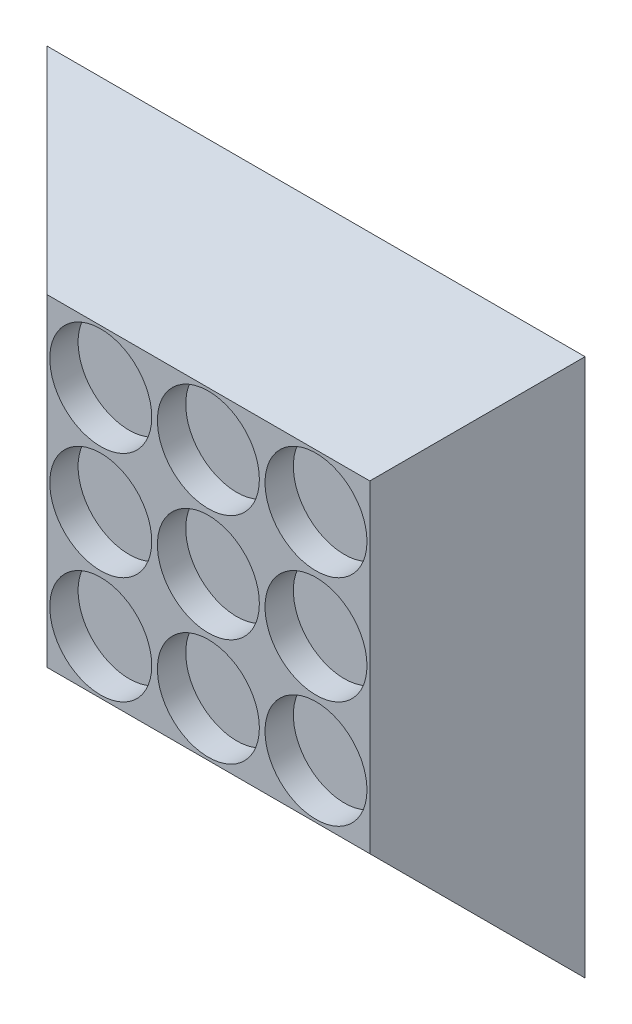
ISO-10303-21;
HEADER;
FILE_DESCRIPTION(('STEP AP214'),'2;1');
FILE_NAME('part.step','',(''),(''),'','','');
FILE_SCHEMA(('AUTOMOTIVE_DESIGN { 1 0 10303 214 1 1 1 1 }'));
ENDSEC;
DATA;
#1=APPLICATION_CONTEXT('core data for automotive mechanical design processes');
#2=APPLICATION_PROTOCOL_DEFINITION('international standard','automotive_design',2000,#1);
#3=PRODUCT_CONTEXT('',#1,'mechanical');
#4=PRODUCT('Part','Part','',(#3));
#5=PRODUCT_RELATED_PRODUCT_CATEGORY('part','',(#4));
#6=PRODUCT_DEFINITION_FORMATION('','',#4);
#7=PRODUCT_DEFINITION_CONTEXT('part definition',#1,'design');
#8=PRODUCT_DEFINITION('design','',#6,#7);
#9=PRODUCT_DEFINITION_SHAPE('','',#8);
#10=(LENGTH_UNIT() NAMED_UNIT(*) SI_UNIT(.MILLI.,.METRE.));
#11=(NAMED_UNIT(*) PLANE_ANGLE_UNIT() SI_UNIT($,.RADIAN.));
#12=(NAMED_UNIT(*) SI_UNIT($,.STERADIAN.) SOLID_ANGLE_UNIT());
#13=UNCERTAINTY_MEASURE_WITH_UNIT(LENGTH_MEASURE(1.E-05),#10,'distance_accuracy_value','');
#14=(GEOMETRIC_REPRESENTATION_CONTEXT(3) GLOBAL_UNCERTAINTY_ASSIGNED_CONTEXT((#13)) GLOBAL_UNIT_ASSIGNED_CONTEXT((#10,
#11,#12)) REPRESENTATION_CONTEXT('',''));
#15=CARTESIAN_POINT('',(0.,0.,0.));
#16=DIRECTION('',(0.,0.,1.));
#17=DIRECTION('',(1.,0.,0.));
#18=AXIS2_PLACEMENT_3D('',#15,#16,#17);
#19=CARTESIAN_POINT('',(0.,0.,19.));
#20=DIRECTION('',(0.,0.,1.));
#21=DIRECTION('',(1.,0.,0.));
#22=AXIS2_PLACEMENT_3D('',#19,#20,#21);
#23=PLANE('',#22);
#24=CARTESIAN_POINT('',(19.,0.,19.));
#25=DIRECTION('',(0.,0.,1.));
#26=DIRECTION('',(1.,0.,0.));
#27=AXIS2_PLACEMENT_3D('',#24,#25,#26);
#28=CIRCLE('',#27,9.);
#29=CARTESIAN_POINT('',(28.,0.,19.));
#30=VERTEX_POINT('',#29);
#31=EDGE_CURVE('E164',#30,#30,#28,.T.);
#32=ORIENTED_EDGE('',*,*,#31,.F.);
#33=EDGE_LOOP('',(#32));
#34=FACE_BOUND('',#33,.T.);
#35=CARTESIAN_POINT('',(18.9999999999999,19.,19.));
#36=DIRECTION('',(0.,0.,1.));
#37=DIRECTION('',(1.,0.,0.));
#38=AXIS2_PLACEMENT_3D('',#35,#36,#37);
#39=CIRCLE('',#38,9.);
#40=CARTESIAN_POINT('',(27.9999999999999,19.,19.));
#41=VERTEX_POINT('',#40);
#42=EDGE_CURVE('E177',#41,#41,#39,.T.);
#43=ORIENTED_EDGE('',*,*,#42,.F.);
#44=EDGE_LOOP('',(#43));
#45=FACE_BOUND('',#44,.T.);
#46=CARTESIAN_POINT('',(0.,19.,19.));
#47=DIRECTION('',(0.,0.,1.));
#48=DIRECTION('',(1.,0.,0.));
#49=AXIS2_PLACEMENT_3D('',#46,#47,#48);
#50=CIRCLE('',#49,9.);
#51=CARTESIAN_POINT('',(8.99999999999993,19.,19.));
#52=VERTEX_POINT('',#51);
#53=EDGE_CURVE('E183',#52,#52,#50,.T.);
#54=ORIENTED_EDGE('',*,*,#53,.F.);
#55=EDGE_LOOP('',(#54));
#56=FACE_BOUND('',#55,.T.);
#57=CARTESIAN_POINT('',(-19.,-1.32676290876039E-13,19.));
#58=DIRECTION('',(0.,0.,1.));
#59=DIRECTION('',(1.,0.,0.));
#60=AXIS2_PLACEMENT_3D('',#57,#58,#59);
#61=CIRCLE('',#60,9.);
#62=CARTESIAN_POINT('',(-10.,-1.32676290876039E-13,19.));
#63=VERTEX_POINT('',#62);
#64=EDGE_CURVE('E189',#63,#63,#61,.T.);
#65=ORIENTED_EDGE('',*,*,#64,.F.);
#66=EDGE_LOOP('',(#65));
#67=FACE_BOUND('',#66,.T.);
#68=CARTESIAN_POINT('',(-18.9999999999998,-19.0000000000001,19.));
#69=DIRECTION('',(0.,0.,1.));
#70=DIRECTION('',(1.,0.,0.));
#71=AXIS2_PLACEMENT_3D('',#68,#69,#70);
#72=CIRCLE('',#71,9.);
#73=CARTESIAN_POINT('',(-9.9999999999998,-19.0000000000001,19.));
#74=VERTEX_POINT('',#73);
#75=EDGE_CURVE('E203',#74,#74,#72,.T.);
#76=ORIENTED_EDGE('',*,*,#75,.F.);
#77=EDGE_LOOP('',(#76));
#78=FACE_BOUND('',#77,.T.);
#79=CARTESIAN_POINT('',(19.0000000000002,-19.,19.));
#80=DIRECTION('',(0.,0.,1.));
#81=DIRECTION('',(1.,0.,0.));
#82=AXIS2_PLACEMENT_3D('',#79,#80,#81);
#83=CIRCLE('',#82,9.);
#84=CARTESIAN_POINT('',(28.0000000000002,-19.,19.));
#85=VERTEX_POINT('',#84);
#86=EDGE_CURVE('E213',#85,#85,#83,.T.);
#87=ORIENTED_EDGE('',*,*,#86,.F.);
#88=EDGE_LOOP('',(#87));
#89=FACE_BOUND('',#88,.T.);
#90=CARTESIAN_POINT('',(1.97851021854869E-13,-19.,19.));
#91=DIRECTION('',(0.,0.,1.));
#92=DIRECTION('',(1.,0.,0.));
#93=AXIS2_PLACEMENT_3D('',#90,#91,#92);
#94=CIRCLE('',#93,9.);
#95=CARTESIAN_POINT('',(9.0000000000002,-19.,19.));
#96=VERTEX_POINT('',#95);
#97=EDGE_CURVE('E172',#96,#96,#94,.T.);
#98=ORIENTED_EDGE('',*,*,#97,.F.);
#99=EDGE_LOOP('',(#98));
#100=FACE_BOUND('',#99,.T.);
#101=CARTESIAN_POINT('',(-19.0000000000001,18.9999999999999,19.));
#102=DIRECTION('',(0.,0.,1.));
#103=DIRECTION('',(1.,0.,0.));
#104=AXIS2_PLACEMENT_3D('',#101,#102,#103);
#105=CIRCLE('',#104,9.);
#106=CARTESIAN_POINT('',(-10.0000000000001,18.9999999999999,19.));
#107=VERTEX_POINT('',#106);
#108=EDGE_CURVE('E195',#107,#107,#105,.T.);
#109=ORIENTED_EDGE('',*,*,#108,.F.);
#110=EDGE_LOOP('',(#109));
#111=FACE_BOUND('',#110,.T.);
#112=CARTESIAN_POINT('',(0.,0.,19.));
#113=DIRECTION('',(0.,0.,1.));
#114=DIRECTION('',(1.,0.,0.));
#115=AXIS2_PLACEMENT_3D('',#112,#113,#114);
#116=CIRCLE('',#115,9.);
#117=CARTESIAN_POINT('',(9.,0.,19.));
#118=VERTEX_POINT('',#117);
#119=EDGE_CURVE('E98',#118,#118,#116,.T.);
#120=ORIENTED_EDGE('',*,*,#119,.F.);
#121=EDGE_LOOP('',(#120));
#122=FACE_BOUND('',#121,.T.);
#123=DIRECTION('',(0.,1.,0.));
#124=VECTOR('',#123,1.);
#125=CARTESIAN_POINT('',(28.5,47.5,19.));
#126=LINE('',#125,#124);
#127=CARTESIAN_POINT('',(28.5,-28.5,19.));
#128=VERTEX_POINT('',#127);
#129=CARTESIAN_POINT('',(28.5,28.5,19.));
#130=VERTEX_POINT('',#129);
#131=EDGE_CURVE('E45',#128,#130,#126,.T.);
#132=ORIENTED_EDGE('',*,*,#131,.T.);
#133=DIRECTION('',(-1.,0.,0.));
#134=VECTOR('',#133,1.);
#135=CARTESIAN_POINT('',(-47.5,28.5,19.));
#136=LINE('',#135,#134);
#137=CARTESIAN_POINT('',(-28.5,28.5,19.));
#138=VERTEX_POINT('',#137);
#139=EDGE_CURVE('E11',#130,#138,#136,.T.);
#140=ORIENTED_EDGE('',*,*,#139,.T.);
#141=DIRECTION('',(0.,-1.,0.));
#142=VECTOR('',#141,1.);
#143=CARTESIAN_POINT('',(-28.5,-47.5,19.));
#144=LINE('',#143,#142);
#145=CARTESIAN_POINT('',(-28.5,-28.5,19.));
#146=VERTEX_POINT('',#145);
#147=EDGE_CURVE('E104',#138,#146,#144,.T.);
#148=ORIENTED_EDGE('',*,*,#147,.T.);
#149=DIRECTION('',(1.,0.,0.));
#150=VECTOR('',#149,1.);
#151=CARTESIAN_POINT('',(47.5,-28.5,19.));
#152=LINE('',#151,#150);
#153=EDGE_CURVE('E56',#146,#128,#152,.T.);
#154=ORIENTED_EDGE('',*,*,#153,.T.);
#155=EDGE_LOOP('',(#132,#140,#148,#154));
#156=FACE_BOUND('',#155,.T.);
#157=ADVANCED_FACE('F35',(#34,#45,#56,#67,#78,#89,#100,#111,#122,#156),#23,.T.);
#158=CARTESIAN_POINT('',(0.,0.,0.));
#159=DIRECTION('',(0.,0.,1.));
#160=DIRECTION('',(1.,0.,0.));
#161=AXIS2_PLACEMENT_3D('',#158,#159,#160);
#162=PLANE('',#161);
#163=DIRECTION('',(0.,-1.,0.));
#164=VECTOR('',#163,1.);
#165=CARTESIAN_POINT('',(-47.5,-47.5,0.));
#166=LINE('',#165,#164);
#167=CARTESIAN_POINT('',(-47.5,47.5,0.));
#168=VERTEX_POINT('',#167);
#169=CARTESIAN_POINT('',(-47.5,-47.5,0.));
#170=VERTEX_POINT('',#169);
#171=EDGE_CURVE('E81',#168,#170,#166,.T.);
#172=ORIENTED_EDGE('',*,*,#171,.F.);
#173=DIRECTION('',(-1.,0.,0.));
#174=VECTOR('',#173,1.);
#175=CARTESIAN_POINT('',(47.5,47.5,0.));
#176=LINE('',#175,#174);
#177=CARTESIAN_POINT('',(47.5,47.5,0.));
#178=VERTEX_POINT('',#177);
#179=EDGE_CURVE('E102',#178,#168,#176,.T.);
#180=ORIENTED_EDGE('',*,*,#179,.F.);
#181=DIRECTION('',(0.,1.,0.));
#182=VECTOR('',#181,1.);
#183=CARTESIAN_POINT('',(47.5,-47.5,0.));
#184=LINE('',#183,#182);
#185=CARTESIAN_POINT('',(47.5,-47.5,0.));
#186=VERTEX_POINT('',#185);
#187=EDGE_CURVE('E84',#186,#178,#184,.T.);
#188=ORIENTED_EDGE('',*,*,#187,.F.);
#189=DIRECTION('',(1.,0.,0.));
#190=VECTOR('',#189,1.);
#191=CARTESIAN_POINT('',(47.5,-47.5,0.));
#192=LINE('',#191,#190);
#193=EDGE_CURVE('E76',#170,#186,#192,.T.);
#194=ORIENTED_EDGE('',*,*,#193,.F.);
#195=EDGE_LOOP('',(#172,#180,#188,#194));
#196=FACE_BOUND('',#195,.T.);
#197=ADVANCED_FACE('F78',(#196),#162,.F.);
#198=CARTESIAN_POINT('',(0.,-28.5,19.));
#199=DIRECTION('',(0.,-0.707106781186549,0.707106781186546));
#200=DIRECTION('',(-1.,0.,0.));
#201=AXIS2_PLACEMENT_3D('',#198,#199,#200);
#202=PLANE('',#201);
#203=DIRECTION('',(0.577350269189625,0.577350269189625,0.577350269189627));
#204=VECTOR('',#203,1.);
#205=CARTESIAN_POINT('',(-19.,-19.,28.5));
#206=LINE('',#205,#204);
#207=EDGE_CURVE('E89',#170,#146,#206,.T.);
#208=ORIENTED_EDGE('',*,*,#207,.F.);
#209=ORIENTED_EDGE('',*,*,#193,.T.);
#210=DIRECTION('',(-0.577350269189625,0.577350269189625,0.577350269189628));
#211=VECTOR('',#210,1.);
#212=CARTESIAN_POINT('',(19.,-19.,28.5));
#213=LINE('',#212,#211);
#214=EDGE_CURVE('E40',#128,#186,#213,.F.);
#215=ORIENTED_EDGE('',*,*,#214,.F.);
#216=ORIENTED_EDGE('',*,*,#153,.F.);
#217=EDGE_LOOP('',(#208,#209,#215,#216));
#218=FACE_BOUND('',#217,.T.);
#219=ADVANCED_FACE('F38',(#218),#202,.T.);
#220=CARTESIAN_POINT('',(28.5,0.,19.));
#221=DIRECTION('',(0.707106781186549,0.,0.707106781186546));
#222=DIRECTION('',(0.,-1.,0.));
#223=AXIS2_PLACEMENT_3D('',#220,#221,#222);
#224=PLANE('',#223);
#225=ORIENTED_EDGE('',*,*,#214,.T.);
#226=ORIENTED_EDGE('',*,*,#187,.T.);
#227=DIRECTION('',(-0.577350269189625,-0.577350269189625,0.577350269189627));
#228=VECTOR('',#227,1.);
#229=CARTESIAN_POINT('',(19.,19.,28.5));
#230=LINE('',#229,#228);
#231=EDGE_CURVE('E92',#130,#178,#230,.F.);
#232=ORIENTED_EDGE('',*,*,#231,.F.);
#233=ORIENTED_EDGE('',*,*,#131,.F.);
#234=EDGE_LOOP('',(#225,#226,#232,#233));
#235=FACE_BOUND('',#234,.T.);
#236=ADVANCED_FACE('F114',(#235),#224,.T.);
#237=CARTESIAN_POINT('',(-28.5,0.,19.));
#238=DIRECTION('',(-0.707106781186549,0.,0.707106781186546));
#239=DIRECTION('',(0.,1.,0.));
#240=AXIS2_PLACEMENT_3D('',#237,#238,#239);
#241=PLANE('',#240);
#242=ORIENTED_EDGE('',*,*,#207,.T.);
#243=ORIENTED_EDGE('',*,*,#147,.F.);
#244=DIRECTION('',(-0.577350269189625,0.577350269189625,-0.577350269189628));
#245=VECTOR('',#244,1.);
#246=CARTESIAN_POINT('',(-19.,19.,28.5));
#247=LINE('',#246,#245);
#248=EDGE_CURVE('E95',#168,#138,#247,.F.);
#249=ORIENTED_EDGE('',*,*,#248,.F.);
#250=ORIENTED_EDGE('',*,*,#171,.T.);
#251=EDGE_LOOP('',(#242,#243,#249,#250));
#252=FACE_BOUND('',#251,.T.);
#253=ADVANCED_FACE('F94',(#252),#241,.T.);
#254=CARTESIAN_POINT('',(0.,28.5,19.));
#255=DIRECTION('',(0.,0.707106781186549,0.707106781186546));
#256=DIRECTION('',(1.,0.,0.));
#257=AXIS2_PLACEMENT_3D('',#254,#255,#256);
#258=PLANE('',#257);
#259=ORIENTED_EDGE('',*,*,#231,.T.);
#260=ORIENTED_EDGE('',*,*,#179,.T.);
#261=ORIENTED_EDGE('',*,*,#248,.T.);
#262=ORIENTED_EDGE('',*,*,#139,.F.);
#263=EDGE_LOOP('',(#259,#260,#261,#262));
#264=FACE_BOUND('',#263,.T.);
#265=ADVANCED_FACE('F112',(#264),#258,.T.);
#266=CARTESIAN_POINT('',(0.,0.,14.));
#267=DIRECTION('',(0.,0.,1.));
#268=DIRECTION('',(1.,0.,0.));
#269=AXIS2_PLACEMENT_3D('',#266,#267,#268);
#270=CYLINDRICAL_SURFACE('',#269,9.);
#271=CARTESIAN_POINT('',(0.,0.,14.));
#272=DIRECTION('',(0.,0.,1.));
#273=DIRECTION('',(1.,0.,0.));
#274=AXIS2_PLACEMENT_3D('',#271,#272,#273);
#275=CIRCLE('',#274,9.);
#276=CARTESIAN_POINT('',(9.,0.,14.));
#277=VERTEX_POINT('',#276);
#278=EDGE_CURVE('E109',#277,#277,#275,.T.);
#279=ORIENTED_EDGE('',*,*,#278,.F.);
#280=EDGE_LOOP('',(#279));
#281=FACE_BOUND('',#280,.T.);
#282=ORIENTED_EDGE('',*,*,#119,.T.);
#283=EDGE_LOOP('',(#282));
#284=FACE_BOUND('',#283,.T.);
#285=ADVANCED_FACE('F132',(#281,#284),#270,.F.);
#286=CARTESIAN_POINT('',(0.,0.,14.));
#287=DIRECTION('',(0.,0.,1.));
#288=DIRECTION('',(1.,0.,0.));
#289=AXIS2_PLACEMENT_3D('',#286,#287,#288);
#290=PLANE('',#289);
#291=ORIENTED_EDGE('',*,*,#278,.T.);
#292=EDGE_LOOP('',(#291));
#293=FACE_BOUND('',#292,.T.);
#294=ADVANCED_FACE('F149',(#293),#290,.T.);
#295=CARTESIAN_POINT('',(-19.0000000000001,18.9999999999999,14.));
#296=DIRECTION('',(0.,0.,1.));
#297=DIRECTION('',(1.,0.,0.));
#298=AXIS2_PLACEMENT_3D('',#295,#296,#297);
#299=CYLINDRICAL_SURFACE('',#298,9.);
#300=CARTESIAN_POINT('',(-19.0000000000001,18.9999999999999,14.));
#301=DIRECTION('',(0.,0.,1.));
#302=DIRECTION('',(1.,0.,0.));
#303=AXIS2_PLACEMENT_3D('',#300,#301,#302);
#304=CIRCLE('',#303,9.);
#305=CARTESIAN_POINT('',(-10.0000000000001,18.9999999999999,14.));
#306=VERTEX_POINT('',#305);
#307=EDGE_CURVE('E191',#306,#306,#304,.T.);
#308=ORIENTED_EDGE('',*,*,#307,.F.);
#309=EDGE_LOOP('',(#308));
#310=FACE_BOUND('',#309,.T.);
#311=ORIENTED_EDGE('',*,*,#108,.T.);
#312=EDGE_LOOP('',(#311));
#313=FACE_BOUND('',#312,.T.);
#314=ADVANCED_FACE('F154',(#310,#313),#299,.F.);
#315=CARTESIAN_POINT('',(-19.0000000000001,18.9999999999999,14.));
#316=DIRECTION('',(0.,0.,1.));
#317=DIRECTION('',(1.,0.,0.));
#318=AXIS2_PLACEMENT_3D('',#315,#316,#317);
#319=PLANE('',#318);
#320=ORIENTED_EDGE('',*,*,#307,.T.);
#321=EDGE_LOOP('',(#320));
#322=FACE_BOUND('',#321,.T.);
#323=ADVANCED_FACE('F235',(#322),#319,.T.);
#324=CARTESIAN_POINT('',(1.97851021854869E-13,-19.,14.));
#325=DIRECTION('',(0.,0.,1.));
#326=DIRECTION('',(1.,0.,0.));
#327=AXIS2_PLACEMENT_3D('',#324,#325,#326);
#328=CYLINDRICAL_SURFACE('',#327,9.);
#329=CARTESIAN_POINT('',(1.97851021854869E-13,-19.,14.));
#330=DIRECTION('',(0.,0.,1.));
#331=DIRECTION('',(1.,0.,0.));
#332=AXIS2_PLACEMENT_3D('',#329,#330,#331);
#333=CIRCLE('',#332,9.);
#334=CARTESIAN_POINT('',(9.0000000000002,-19.,14.));
#335=VERTEX_POINT('',#334);
#336=EDGE_CURVE('E200',#335,#335,#333,.T.);
#337=ORIENTED_EDGE('',*,*,#336,.F.);
#338=EDGE_LOOP('',(#337));
#339=FACE_BOUND('',#338,.T.);
#340=ORIENTED_EDGE('',*,*,#97,.T.);
#341=EDGE_LOOP('',(#340));
#342=FACE_BOUND('',#341,.T.);
#343=ADVANCED_FACE('F241',(#339,#342),#328,.F.);
#344=CARTESIAN_POINT('',(1.97851021854869E-13,-19.,14.));
#345=DIRECTION('',(0.,0.,1.));
#346=DIRECTION('',(1.,0.,0.));
#347=AXIS2_PLACEMENT_3D('',#344,#345,#346);
#348=PLANE('',#347);
#349=ORIENTED_EDGE('',*,*,#336,.T.);
#350=EDGE_LOOP('',(#349));
#351=FACE_BOUND('',#350,.T.);
#352=ADVANCED_FACE('F245',(#351),#348,.T.);
#353=CARTESIAN_POINT('',(19.0000000000002,-19.,14.));
#354=DIRECTION('',(0.,0.,1.));
#355=DIRECTION('',(1.,0.,0.));
#356=AXIS2_PLACEMENT_3D('',#353,#354,#355);
#357=CYLINDRICAL_SURFACE('',#356,9.);
#358=CARTESIAN_POINT('',(19.0000000000002,-19.,14.));
#359=DIRECTION('',(0.,0.,1.));
#360=DIRECTION('',(1.,0.,0.));
#361=AXIS2_PLACEMENT_3D('',#358,#359,#360);
#362=CIRCLE('',#361,9.);
#363=CARTESIAN_POINT('',(28.0000000000002,-19.,14.));
#364=VERTEX_POINT('',#363);
#365=EDGE_CURVE('E209',#364,#364,#362,.T.);
#366=ORIENTED_EDGE('',*,*,#365,.F.);
#367=EDGE_LOOP('',(#366));
#368=FACE_BOUND('',#367,.T.);
#369=ORIENTED_EDGE('',*,*,#86,.T.);
#370=EDGE_LOOP('',(#369));
#371=FACE_BOUND('',#370,.T.);
#372=ADVANCED_FACE('F248',(#368,#371),#357,.F.);
#373=CARTESIAN_POINT('',(19.0000000000002,-19.,14.));
#374=DIRECTION('',(0.,0.,1.));
#375=DIRECTION('',(1.,0.,0.));
#376=AXIS2_PLACEMENT_3D('',#373,#374,#375);
#377=PLANE('',#376);
#378=ORIENTED_EDGE('',*,*,#365,.T.);
#379=EDGE_LOOP('',(#378));
#380=FACE_BOUND('',#379,.T.);
#381=ADVANCED_FACE('F291',(#380),#377,.T.);
#382=CARTESIAN_POINT('',(-18.9999999999998,-19.0000000000001,14.));
#383=DIRECTION('',(0.,0.,1.));
#384=DIRECTION('',(1.,0.,0.));
#385=AXIS2_PLACEMENT_3D('',#382,#383,#384);
#386=CYLINDRICAL_SURFACE('',#385,9.);
#387=CARTESIAN_POINT('',(-18.9999999999998,-19.0000000000001,14.));
#388=DIRECTION('',(0.,0.,1.));
#389=DIRECTION('',(1.,0.,0.));
#390=AXIS2_PLACEMENT_3D('',#387,#388,#389);
#391=CIRCLE('',#390,9.);
#392=CARTESIAN_POINT('',(-9.9999999999998,-19.0000000000001,14.));
#393=VERTEX_POINT('',#392);
#394=EDGE_CURVE('E218',#393,#393,#391,.T.);
#395=ORIENTED_EDGE('',*,*,#394,.F.);
#396=EDGE_LOOP('',(#395));
#397=FACE_BOUND('',#396,.T.);
#398=ORIENTED_EDGE('',*,*,#75,.T.);
#399=EDGE_LOOP('',(#398));
#400=FACE_BOUND('',#399,.T.);
#401=ADVANCED_FACE('F226',(#397,#400),#386,.F.);
#402=CARTESIAN_POINT('',(-18.9999999999998,-19.0000000000001,14.));
#403=DIRECTION('',(0.,0.,1.));
#404=DIRECTION('',(1.,0.,0.));
#405=AXIS2_PLACEMENT_3D('',#402,#403,#404);
#406=PLANE('',#405);
#407=ORIENTED_EDGE('',*,*,#394,.T.);
#408=EDGE_LOOP('',(#407));
#409=FACE_BOUND('',#408,.T.);
#410=ADVANCED_FACE('F281',(#409),#406,.T.);
#411=CARTESIAN_POINT('',(-19.,-1.32676290876039E-13,14.));
#412=DIRECTION('',(0.,0.,1.));
#413=DIRECTION('',(1.,0.,0.));
#414=AXIS2_PLACEMENT_3D('',#411,#412,#413);
#415=CYLINDRICAL_SURFACE('',#414,9.);
#416=CARTESIAN_POINT('',(-19.,-1.32676290876039E-13,14.));
#417=DIRECTION('',(0.,0.,1.));
#418=DIRECTION('',(1.,0.,0.));
#419=AXIS2_PLACEMENT_3D('',#416,#417,#418);
#420=CIRCLE('',#419,9.);
#421=CARTESIAN_POINT('',(-10.,-1.32676290876039E-13,14.));
#422=VERTEX_POINT('',#421);
#423=EDGE_CURVE('E186',#422,#422,#420,.T.);
#424=ORIENTED_EDGE('',*,*,#423,.F.);
#425=EDGE_LOOP('',(#424));
#426=FACE_BOUND('',#425,.T.);
#427=ORIENTED_EDGE('',*,*,#64,.T.);
#428=EDGE_LOOP('',(#427));
#429=FACE_BOUND('',#428,.T.);
#430=ADVANCED_FACE('F278',(#426,#429),#415,.F.);
#431=CARTESIAN_POINT('',(-19.,-1.32676290876039E-13,14.));
#432=DIRECTION('',(0.,0.,1.));
#433=DIRECTION('',(1.,0.,0.));
#434=AXIS2_PLACEMENT_3D('',#431,#432,#433);
#435=PLANE('',#434);
#436=ORIENTED_EDGE('',*,*,#423,.T.);
#437=EDGE_LOOP('',(#436));
#438=FACE_BOUND('',#437,.T.);
#439=ADVANCED_FACE('F274',(#438),#435,.T.);
#440=CARTESIAN_POINT('',(0.,19.,14.));
#441=DIRECTION('',(0.,0.,1.));
#442=DIRECTION('',(1.,0.,0.));
#443=AXIS2_PLACEMENT_3D('',#440,#441,#442);
#444=CYLINDRICAL_SURFACE('',#443,9.);
#445=CARTESIAN_POINT('',(0.,19.,14.));
#446=DIRECTION('',(0.,0.,1.));
#447=DIRECTION('',(1.,0.,0.));
#448=AXIS2_PLACEMENT_3D('',#445,#446,#447);
#449=CIRCLE('',#448,9.);
#450=CARTESIAN_POINT('',(8.99999999999993,19.,14.));
#451=VERTEX_POINT('',#450);
#452=EDGE_CURVE('E180',#451,#451,#449,.T.);
#453=ORIENTED_EDGE('',*,*,#452,.F.);
#454=EDGE_LOOP('',(#453));
#455=FACE_BOUND('',#454,.T.);
#456=ORIENTED_EDGE('',*,*,#53,.T.);
#457=EDGE_LOOP('',(#456));
#458=FACE_BOUND('',#457,.T.);
#459=ADVANCED_FACE('F270',(#455,#458),#444,.F.);
#460=CARTESIAN_POINT('',(0.,19.,14.));
#461=DIRECTION('',(0.,0.,1.));
#462=DIRECTION('',(1.,0.,0.));
#463=AXIS2_PLACEMENT_3D('',#460,#461,#462);
#464=PLANE('',#463);
#465=ORIENTED_EDGE('',*,*,#452,.T.);
#466=EDGE_LOOP('',(#465));
#467=FACE_BOUND('',#466,.T.);
#468=ADVANCED_FACE('F266',(#467),#464,.T.);
#469=CARTESIAN_POINT('',(18.9999999999999,19.,14.));
#470=DIRECTION('',(0.,0.,1.));
#471=DIRECTION('',(1.,0.,0.));
#472=AXIS2_PLACEMENT_3D('',#469,#470,#471);
#473=CYLINDRICAL_SURFACE('',#472,9.);
#474=CARTESIAN_POINT('',(18.9999999999999,19.,14.));
#475=DIRECTION('',(0.,0.,1.));
#476=DIRECTION('',(1.,0.,0.));
#477=AXIS2_PLACEMENT_3D('',#474,#475,#476);
#478=CIRCLE('',#477,9.);
#479=CARTESIAN_POINT('',(27.9999999999999,19.,14.));
#480=VERTEX_POINT('',#479);
#481=EDGE_CURVE('E169',#480,#480,#478,.T.);
#482=ORIENTED_EDGE('',*,*,#481,.F.);
#483=EDGE_LOOP('',(#482));
#484=FACE_BOUND('',#483,.T.);
#485=ORIENTED_EDGE('',*,*,#42,.T.);
#486=EDGE_LOOP('',(#485));
#487=FACE_BOUND('',#486,.T.);
#488=ADVANCED_FACE('F262',(#484,#487),#473,.F.);
#489=CARTESIAN_POINT('',(18.9999999999999,19.,14.));
#490=DIRECTION('',(0.,0.,1.));
#491=DIRECTION('',(1.,0.,0.));
#492=AXIS2_PLACEMENT_3D('',#489,#490,#491);
#493=PLANE('',#492);
#494=ORIENTED_EDGE('',*,*,#481,.T.);
#495=EDGE_LOOP('',(#494));
#496=FACE_BOUND('',#495,.T.);
#497=ADVANCED_FACE('F258',(#496),#493,.T.);
#498=CARTESIAN_POINT('',(19.,0.,14.));
#499=DIRECTION('',(0.,0.,1.));
#500=DIRECTION('',(1.,0.,0.));
#501=AXIS2_PLACEMENT_3D('',#498,#499,#500);
#502=CYLINDRICAL_SURFACE('',#501,9.);
#503=CARTESIAN_POINT('',(19.,0.,14.));
#504=DIRECTION('',(0.,0.,1.));
#505=DIRECTION('',(1.,0.,0.));
#506=AXIS2_PLACEMENT_3D('',#503,#504,#505);
#507=CIRCLE('',#506,9.);
#508=CARTESIAN_POINT('',(28.,0.,14.));
#509=VERTEX_POINT('',#508);
#510=EDGE_CURVE('E162',#509,#509,#507,.T.);
#511=ORIENTED_EDGE('',*,*,#510,.F.);
#512=EDGE_LOOP('',(#511));
#513=FACE_BOUND('',#512,.T.);
#514=ORIENTED_EDGE('',*,*,#31,.T.);
#515=EDGE_LOOP('',(#514));
#516=FACE_BOUND('',#515,.T.);
#517=ADVANCED_FACE('F255',(#513,#516),#502,.F.);
#518=CARTESIAN_POINT('',(19.,0.,14.));
#519=DIRECTION('',(0.,0.,1.));
#520=DIRECTION('',(1.,0.,0.));
#521=AXIS2_PLACEMENT_3D('',#518,#519,#520);
#522=PLANE('',#521);
#523=ORIENTED_EDGE('',*,*,#510,.T.);
#524=EDGE_LOOP('',(#523));
#525=FACE_BOUND('',#524,.T.);
#526=ADVANCED_FACE('F252',(#525),#522,.T.);
#527=CLOSED_SHELL('',(#157,#197,#219,#236,#253,#265,#285,#294,#314,#323,#343,#352,#372,#381,
#401,#410,#430,#439,#459,#468,#488,#497,#517,#526));
#528=MANIFOLD_SOLID_BREP('B2',#527);
#529=ADVANCED_BREP_SHAPE_REPRESENTATION('',(#18,#528),#14);
#530=SHAPE_DEFINITION_REPRESENTATION(#9,#529);
ENDSEC;
END-ISO-10303-21;
